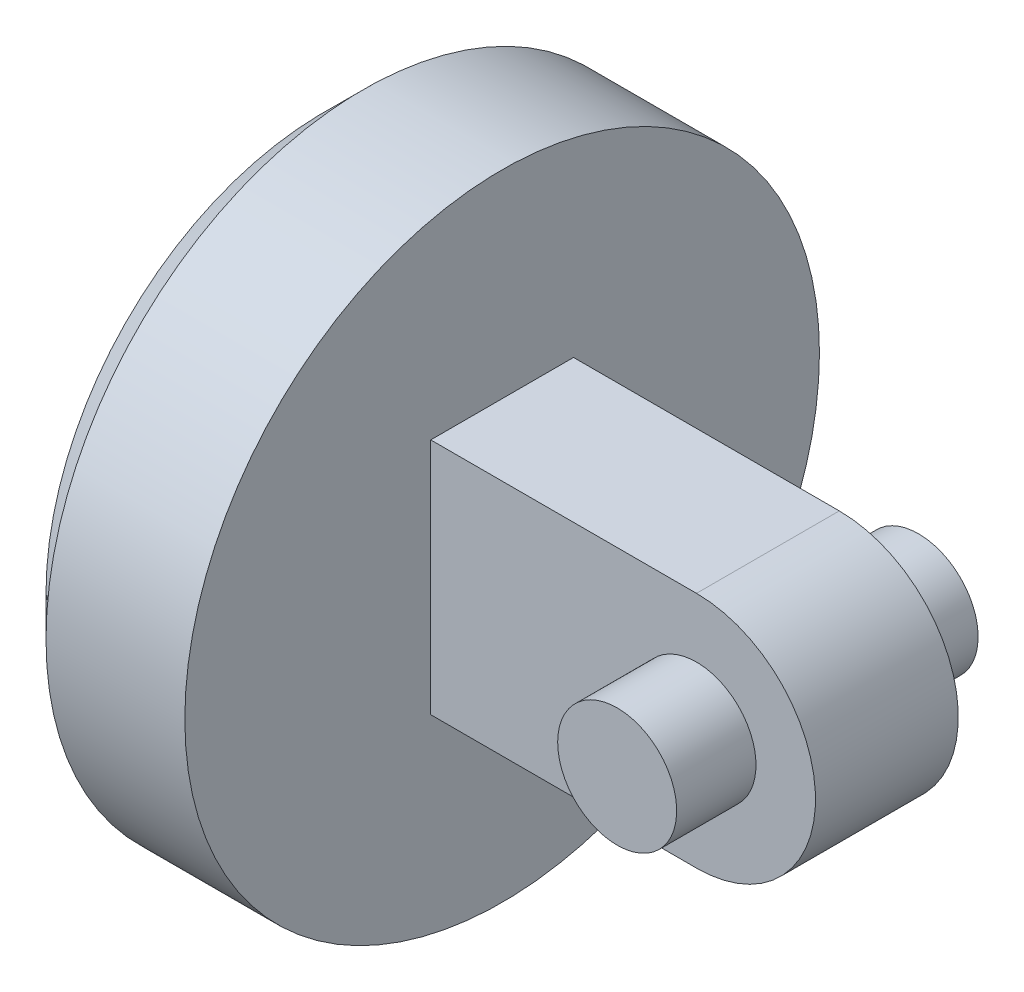
ISO-10303-21;
HEADER;
FILE_DESCRIPTION(('STEP AP214'),'2;1');
FILE_NAME('part.step','',(''),(''),'','','');
FILE_SCHEMA(('AUTOMOTIVE_DESIGN { 1 0 10303 214 1 1 1 1 }'));
ENDSEC;
DATA;
#1=APPLICATION_CONTEXT('core data for automotive mechanical design processes');
#2=APPLICATION_PROTOCOL_DEFINITION('international standard','automotive_design',2000,#1);
#3=PRODUCT_CONTEXT('',#1,'mechanical');
#4=PRODUCT('Part','Part','',(#3));
#5=PRODUCT_RELATED_PRODUCT_CATEGORY('part','',(#4));
#6=PRODUCT_DEFINITION_FORMATION('','',#4);
#7=PRODUCT_DEFINITION_CONTEXT('part definition',#1,'design');
#8=PRODUCT_DEFINITION('design','',#6,#7);
#9=PRODUCT_DEFINITION_SHAPE('','',#8);
#10=(LENGTH_UNIT() NAMED_UNIT(*) SI_UNIT(.MILLI.,.METRE.));
#11=(NAMED_UNIT(*) PLANE_ANGLE_UNIT() SI_UNIT($,.RADIAN.));
#12=(NAMED_UNIT(*) SI_UNIT($,.STERADIAN.) SOLID_ANGLE_UNIT());
#13=UNCERTAINTY_MEASURE_WITH_UNIT(LENGTH_MEASURE(1.E-05),#10,'distance_accuracy_value','');
#14=(GEOMETRIC_REPRESENTATION_CONTEXT(3) GLOBAL_UNCERTAINTY_ASSIGNED_CONTEXT((#13)) GLOBAL_UNIT_ASSIGNED_CONTEXT((#10,
#11,#12)) REPRESENTATION_CONTEXT('',''));
#15=CARTESIAN_POINT('',(0.,0.,0.));
#16=DIRECTION('',(0.,0.,1.));
#17=DIRECTION('',(1.,0.,0.));
#18=AXIS2_PLACEMENT_3D('',#15,#16,#17);
#19=CARTESIAN_POINT('',(6.7,0.,-1.8));
#20=DIRECTION('',(0.,0.,1.));
#21=DIRECTION('',(1.,0.,0.));
#22=AXIS2_PLACEMENT_3D('',#19,#20,#21);
#23=PLANE('',#22);
#24=DIRECTION('',(0.,-1.,0.));
#25=VECTOR('',#24,1.);
#26=CARTESIAN_POINT('',(0.,3.,-1.8));
#27=LINE('',#26,#25);
#28=CARTESIAN_POINT('',(0.,3.,-1.8));
#29=VERTEX_POINT('',#28);
#30=CARTESIAN_POINT('',(0.,-3.,-1.8));
#31=VERTEX_POINT('',#30);
#32=EDGE_CURVE('E100',#29,#31,#27,.T.);
#33=ORIENTED_EDGE('',*,*,#32,.F.);
#34=DIRECTION('',(-1.,0.,0.));
#35=VECTOR('',#34,1.);
#36=CARTESIAN_POINT('',(0.,3.,-1.8));
#37=LINE('',#36,#35);
#38=CARTESIAN_POINT('',(6.7,3.,-1.8));
#39=VERTEX_POINT('',#38);
#40=EDGE_CURVE('E106',#39,#29,#37,.T.);
#41=ORIENTED_EDGE('',*,*,#40,.F.);
#42=CARTESIAN_POINT('',(6.7,0.,-1.8));
#43=DIRECTION('',(0.,0.,1.));
#44=DIRECTION('',(1.,0.,0.));
#45=AXIS2_PLACEMENT_3D('',#42,#43,#44);
#46=CIRCLE('',#45,3.);
#47=CARTESIAN_POINT('',(6.7,-3.,-1.8));
#48=VERTEX_POINT('',#47);
#49=EDGE_CURVE('E104',#48,#39,#46,.T.);
#50=ORIENTED_EDGE('',*,*,#49,.F.);
#51=DIRECTION('',(1.,0.,0.));
#52=VECTOR('',#51,1.);
#53=CARTESIAN_POINT('',(0.,-3.,-1.8));
#54=LINE('',#53,#52);
#55=EDGE_CURVE('E86',#31,#48,#54,.T.);
#56=ORIENTED_EDGE('',*,*,#55,.F.);
#57=EDGE_LOOP('',(#33,#41,#50,#56));
#58=FACE_BOUND('',#57,.T.);
#59=CARTESIAN_POINT('',(6.7,0.,-1.8));
#60=DIRECTION('',(0.,0.,1.));
#61=DIRECTION('',(1.,0.,0.));
#62=AXIS2_PLACEMENT_3D('',#59,#60,#61);
#63=CIRCLE('',#62,1.5);
#64=CARTESIAN_POINT('',(8.2,0.,-1.8));
#65=VERTEX_POINT('',#64);
#66=EDGE_CURVE('E11',#65,#65,#63,.F.);
#67=ORIENTED_EDGE('',*,*,#66,.F.);
#68=EDGE_LOOP('',(#67));
#69=FACE_BOUND('',#68,.T.);
#70=ADVANCED_FACE('F35',(#58,#69),#23,.F.);
#71=CARTESIAN_POINT('',(6.7,0.,1.8));
#72=DIRECTION('',(0.,0.,1.));
#73=DIRECTION('',(1.,0.,0.));
#74=AXIS2_PLACEMENT_3D('',#71,#72,#73);
#75=PLANE('',#74);
#76=DIRECTION('',(0.,-1.,0.));
#77=VECTOR('',#76,1.);
#78=CARTESIAN_POINT('',(0.,3.,1.8));
#79=LINE('',#78,#77);
#80=CARTESIAN_POINT('',(0.,3.,1.8));
#81=VERTEX_POINT('',#80);
#82=CARTESIAN_POINT('',(0.,-3.,1.8));
#83=VERTEX_POINT('',#82);
#84=EDGE_CURVE('E55',#81,#83,#79,.T.);
#85=ORIENTED_EDGE('',*,*,#84,.T.);
#86=DIRECTION('',(1.,0.,0.));
#87=VECTOR('',#86,1.);
#88=CARTESIAN_POINT('',(0.,-3.,1.8));
#89=LINE('',#88,#87);
#90=CARTESIAN_POINT('',(6.7,-3.,1.8));
#91=VERTEX_POINT('',#90);
#92=EDGE_CURVE('E73',#83,#91,#89,.T.);
#93=ORIENTED_EDGE('',*,*,#92,.T.);
#94=CARTESIAN_POINT('',(6.7,0.,1.8));
#95=DIRECTION('',(0.,0.,1.));
#96=DIRECTION('',(1.,0.,0.));
#97=AXIS2_PLACEMENT_3D('',#94,#95,#96);
#98=CIRCLE('',#97,3.);
#99=CARTESIAN_POINT('',(6.7,3.,1.8));
#100=VERTEX_POINT('',#99);
#101=EDGE_CURVE('E78',#91,#100,#98,.T.);
#102=ORIENTED_EDGE('',*,*,#101,.T.);
#103=DIRECTION('',(-1.,0.,0.));
#104=VECTOR('',#103,1.);
#105=CARTESIAN_POINT('',(0.,3.,1.8));
#106=LINE('',#105,#104);
#107=EDGE_CURVE('E94',#100,#81,#106,.T.);
#108=ORIENTED_EDGE('',*,*,#107,.T.);
#109=EDGE_LOOP('',(#85,#93,#102,#108));
#110=FACE_BOUND('',#109,.T.);
#111=CARTESIAN_POINT('',(6.7,0.,1.8));
#112=DIRECTION('',(0.,0.,-1.));
#113=DIRECTION('',(-1.,0.,0.));
#114=AXIS2_PLACEMENT_3D('',#111,#112,#113);
#115=CIRCLE('',#114,1.5);
#116=CARTESIAN_POINT('',(5.2,0.,1.8));
#117=VERTEX_POINT('',#116);
#118=EDGE_CURVE('E250',#117,#117,#115,.T.);
#119=ORIENTED_EDGE('',*,*,#118,.T.);
#120=EDGE_LOOP('',(#119));
#121=FACE_BOUND('',#120,.T.);
#122=ADVANCED_FACE('F75',(#110,#121),#75,.T.);
#123=CARTESIAN_POINT('',(-3.5,0.,0.));
#124=DIRECTION('',(1.,0.,0.));
#125=DIRECTION('',(0.,0.,-1.));
#126=AXIS2_PLACEMENT_3D('',#123,#124,#125);
#127=CONICAL_SURFACE('',#126,8.,0.785398163397448);
#128=CARTESIAN_POINT('',(-4.5,0.,0.));
#129=DIRECTION('',(-1.,0.,0.));
#130=DIRECTION('',(0.,0.,1.));
#131=AXIS2_PLACEMENT_3D('',#128,#129,#130);
#132=CIRCLE('',#131,7.);
#133=CARTESIAN_POINT('',(-4.5,0.,7.));
#134=VERTEX_POINT('',#133);
#135=EDGE_CURVE('E112',#134,#134,#132,.T.);
#136=ORIENTED_EDGE('',*,*,#135,.F.);
#137=EDGE_LOOP('',(#136));
#138=FACE_BOUND('',#137,.T.);
#139=CARTESIAN_POINT('',(-3.5,0.,0.));
#140=DIRECTION('',(-1.,0.,0.));
#141=DIRECTION('',(0.,0.,1.));
#142=AXIS2_PLACEMENT_3D('',#139,#140,#141);
#143=CIRCLE('',#142,8.);
#144=CARTESIAN_POINT('',(-3.5,0.,8.));
#145=VERTEX_POINT('',#144);
#146=EDGE_CURVE('E43',#145,#145,#143,.T.);
#147=ORIENTED_EDGE('',*,*,#146,.T.);
#148=EDGE_LOOP('',(#147));
#149=FACE_BOUND('',#148,.T.);
#150=ADVANCED_FACE('F37',(#138,#149),#127,.T.);
#151=CARTESIAN_POINT('',(-4.5,0.,0.));
#152=DIRECTION('',(-1.,0.,0.));
#153=DIRECTION('',(0.,0.,1.));
#154=AXIS2_PLACEMENT_3D('',#151,#152,#153);
#155=CYLINDRICAL_SURFACE('',#154,8.);
#156=ORIENTED_EDGE('',*,*,#146,.F.);
#157=EDGE_LOOP('',(#156));
#158=FACE_BOUND('',#157,.T.);
#159=CARTESIAN_POINT('',(0.,0.,0.));
#160=DIRECTION('',(-1.,0.,0.));
#161=DIRECTION('',(0.,0.,1.));
#162=AXIS2_PLACEMENT_3D('',#159,#160,#161);
#163=CIRCLE('',#162,8.);
#164=CARTESIAN_POINT('',(0.,0.,8.));
#165=VERTEX_POINT('',#164);
#166=EDGE_CURVE('E115',#165,#165,#163,.T.);
#167=ORIENTED_EDGE('',*,*,#166,.T.);
#168=EDGE_LOOP('',(#167));
#169=FACE_BOUND('',#168,.T.);
#170=ADVANCED_FACE('F121',(#158,#169),#155,.T.);
#171=CARTESIAN_POINT('',(0.,8.,0.));
#172=DIRECTION('',(-1.,0.,0.));
#173=DIRECTION('',(0.,0.,1.));
#174=AXIS2_PLACEMENT_3D('',#171,#172,#173);
#175=PLANE('',#174);
#176=DIRECTION('',(0.,0.,-1.));
#177=VECTOR('',#176,1.);
#178=CARTESIAN_POINT('',(0.,-3.,1.8));
#179=LINE('',#178,#177);
#180=EDGE_CURVE('E50',#83,#31,#179,.T.);
#181=ORIENTED_EDGE('',*,*,#180,.F.);
#182=ORIENTED_EDGE('',*,*,#84,.F.);
#183=DIRECTION('',(0.,0.,-1.));
#184=VECTOR('',#183,1.);
#185=CARTESIAN_POINT('',(0.,3.,1.8));
#186=LINE('',#185,#184);
#187=EDGE_CURVE('E96',#81,#29,#186,.T.);
#188=ORIENTED_EDGE('',*,*,#187,.T.);
#189=ORIENTED_EDGE('',*,*,#32,.T.);
#190=EDGE_LOOP('',(#181,#182,#188,#189));
#191=FACE_BOUND('',#190,.T.);
#192=ORIENTED_EDGE('',*,*,#166,.F.);
#193=EDGE_LOOP('',(#192));
#194=FACE_BOUND('',#193,.T.);
#195=ADVANCED_FACE('F124',(#191,#194),#175,.F.);
#196=CARTESIAN_POINT('',(-4.5,7.,0.));
#197=DIRECTION('',(1.,0.,0.));
#198=DIRECTION('',(0.,0.,-1.));
#199=AXIS2_PLACEMENT_3D('',#196,#197,#198);
#200=PLANE('',#199);
#201=ORIENTED_EDGE('',*,*,#135,.T.);
#202=EDGE_LOOP('',(#201));
#203=FACE_BOUND('',#202,.T.);
#204=ADVANCED_FACE('F128',(#203),#200,.F.);
#205=CARTESIAN_POINT('',(0.,-3.,1.8));
#206=DIRECTION('',(0.,1.,0.));
#207=DIRECTION('',(0.,0.,1.));
#208=AXIS2_PLACEMENT_3D('',#205,#206,#207);
#209=PLANE('',#208);
#210=ORIENTED_EDGE('',*,*,#55,.T.);
#211=DIRECTION('',(0.,0.,-1.));
#212=VECTOR('',#211,1.);
#213=CARTESIAN_POINT('',(6.7,-3.,1.8));
#214=LINE('',#213,#212);
#215=EDGE_CURVE('E83',#91,#48,#214,.T.);
#216=ORIENTED_EDGE('',*,*,#215,.F.);
#217=ORIENTED_EDGE('',*,*,#92,.F.);
#218=ORIENTED_EDGE('',*,*,#180,.T.);
#219=EDGE_LOOP('',(#210,#216,#217,#218));
#220=FACE_BOUND('',#219,.T.);
#221=ADVANCED_FACE('F84',(#220),#209,.F.);
#222=CARTESIAN_POINT('',(6.7,0.,1.8));
#223=DIRECTION('',(0.,0.,-1.));
#224=DIRECTION('',(-1.,0.,0.));
#225=AXIS2_PLACEMENT_3D('',#222,#223,#224);
#226=CYLINDRICAL_SURFACE('',#225,3.);
#227=ORIENTED_EDGE('',*,*,#49,.T.);
#228=DIRECTION('',(0.,0.,-1.));
#229=VECTOR('',#228,1.);
#230=CARTESIAN_POINT('',(6.7,3.,1.8));
#231=LINE('',#230,#229);
#232=EDGE_CURVE('E89',#100,#39,#231,.T.);
#233=ORIENTED_EDGE('',*,*,#232,.F.);
#234=ORIENTED_EDGE('',*,*,#101,.F.);
#235=ORIENTED_EDGE('',*,*,#215,.T.);
#236=EDGE_LOOP('',(#227,#233,#234,#235));
#237=FACE_BOUND('',#236,.T.);
#238=ADVANCED_FACE('F91',(#237),#226,.T.);
#239=CARTESIAN_POINT('',(0.,3.,1.8));
#240=DIRECTION('',(0.,-1.,0.));
#241=DIRECTION('',(0.,0.,-1.));
#242=AXIS2_PLACEMENT_3D('',#239,#240,#241);
#243=PLANE('',#242);
#244=ORIENTED_EDGE('',*,*,#40,.T.);
#245=ORIENTED_EDGE('',*,*,#187,.F.);
#246=ORIENTED_EDGE('',*,*,#107,.F.);
#247=ORIENTED_EDGE('',*,*,#232,.T.);
#248=EDGE_LOOP('',(#244,#245,#246,#247));
#249=FACE_BOUND('',#248,.T.);
#250=ADVANCED_FACE('F146',(#249),#243,.F.);
#251=CARTESIAN_POINT('',(6.7,0.,3.8));
#252=DIRECTION('',(0.,0.,-1.));
#253=DIRECTION('',(-1.,0.,0.));
#254=AXIS2_PLACEMENT_3D('',#251,#252,#253);
#255=PLANE('',#254);
#256=CARTESIAN_POINT('',(6.7,0.,3.8));
#257=DIRECTION('',(0.,0.,-1.));
#258=DIRECTION('',(-1.,0.,0.));
#259=AXIS2_PLACEMENT_3D('',#256,#257,#258);
#260=CIRCLE('',#259,1.5);
#261=CARTESIAN_POINT('',(5.2,0.,3.8));
#262=VERTEX_POINT('',#261);
#263=EDGE_CURVE('E102',#262,#262,#260,.T.);
#264=ORIENTED_EDGE('',*,*,#263,.F.);
#265=EDGE_LOOP('',(#264));
#266=FACE_BOUND('',#265,.T.);
#267=ADVANCED_FACE('F149',(#266),#255,.F.);
#268=CARTESIAN_POINT('',(6.7,0.,1.8));
#269=DIRECTION('',(0.,0.,-1.));
#270=DIRECTION('',(-1.,0.,0.));
#271=AXIS2_PLACEMENT_3D('',#268,#269,#270);
#272=CYLINDRICAL_SURFACE('',#271,1.5);
#273=ORIENTED_EDGE('',*,*,#118,.F.);
#274=EDGE_LOOP('',(#273));
#275=FACE_BOUND('',#274,.T.);
#276=ORIENTED_EDGE('',*,*,#263,.T.);
#277=EDGE_LOOP('',(#276));
#278=FACE_BOUND('',#277,.T.);
#279=ADVANCED_FACE('F173',(#275,#278),#272,.T.);
#280=CARTESIAN_POINT('',(6.7,0.,-3.8));
#281=DIRECTION('',(0.,0.,1.));
#282=DIRECTION('',(-1.,0.,0.));
#283=AXIS2_PLACEMENT_3D('',#280,#281,#282);
#284=PLANE('',#283);
#285=CARTESIAN_POINT('',(6.7,0.,-3.8));
#286=DIRECTION('',(0.,0.,-1.));
#287=DIRECTION('',(-1.,0.,0.));
#288=AXIS2_PLACEMENT_3D('',#285,#286,#287);
#289=CIRCLE('',#288,1.5);
#290=CARTESIAN_POINT('',(5.2,0.,-3.8));
#291=VERTEX_POINT('',#290);
#292=EDGE_CURVE('E249',#291,#291,#289,.T.);
#293=ORIENTED_EDGE('',*,*,#292,.T.);
#294=EDGE_LOOP('',(#293));
#295=FACE_BOUND('',#294,.T.);
#296=ADVANCED_FACE('F180',(#295),#284,.F.);
#297=CARTESIAN_POINT('',(6.7,0.,-1.8));
#298=DIRECTION('',(0.,0.,1.));
#299=DIRECTION('',(-1.,0.,0.));
#300=AXIS2_PLACEMENT_3D('',#297,#298,#299);
#301=CYLINDRICAL_SURFACE('',#300,1.5);
#302=ORIENTED_EDGE('',*,*,#66,.T.);
#303=EDGE_LOOP('',(#302));
#304=FACE_BOUND('',#303,.T.);
#305=ORIENTED_EDGE('',*,*,#292,.F.);
#306=EDGE_LOOP('',(#305));
#307=FACE_BOUND('',#306,.T.);
#308=ADVANCED_FACE('F188',(#304,#307),#301,.T.);
#309=CLOSED_SHELL('',(#70,#122,#150,#170,#195,#204,#221,#238,#250,#267,#279,#296,#308));
#310=MANIFOLD_SOLID_BREP('B2',#309);
#311=ADVANCED_BREP_SHAPE_REPRESENTATION('',(#18,#310),#14);
#312=SHAPE_DEFINITION_REPRESENTATION(#9,#311);
ENDSEC;
END-ISO-10303-21;
